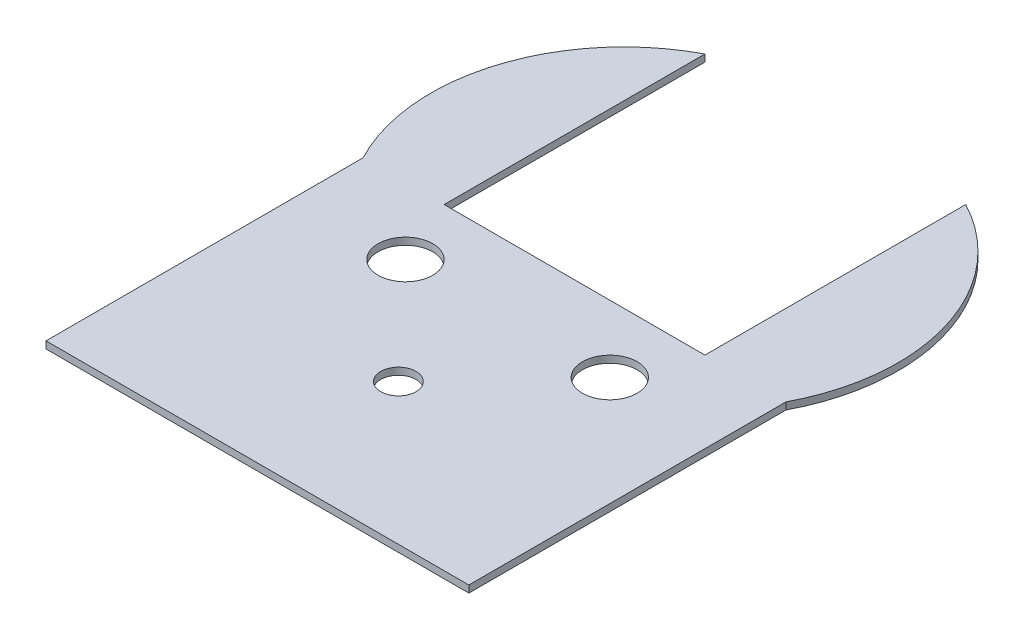
ISO-10303-21;
HEADER;
FILE_DESCRIPTION(('STEP AP214'),'2;1');
FILE_NAME('part.step','',(''),(''),'','','');
FILE_SCHEMA(('AUTOMOTIVE_DESIGN { 1 0 10303 214 1 1 1 1 }'));
ENDSEC;
DATA;
#1=APPLICATION_CONTEXT('core data for automotive mechanical design processes');
#2=APPLICATION_PROTOCOL_DEFINITION('international standard','automotive_design',2000,#1);
#3=PRODUCT_CONTEXT('',#1,'mechanical');
#4=PRODUCT('Part','Part','',(#3));
#5=PRODUCT_RELATED_PRODUCT_CATEGORY('part','',(#4));
#6=PRODUCT_DEFINITION_FORMATION('','',#4);
#7=PRODUCT_DEFINITION_CONTEXT('part definition',#1,'design');
#8=PRODUCT_DEFINITION('design','',#6,#7);
#9=PRODUCT_DEFINITION_SHAPE('','',#8);
#10=(LENGTH_UNIT() NAMED_UNIT(*) SI_UNIT(.MILLI.,.METRE.));
#11=(NAMED_UNIT(*) PLANE_ANGLE_UNIT() SI_UNIT($,.RADIAN.));
#12=(NAMED_UNIT(*) SI_UNIT($,.STERADIAN.) SOLID_ANGLE_UNIT());
#13=UNCERTAINTY_MEASURE_WITH_UNIT(LENGTH_MEASURE(1.E-05),#10,'distance_accuracy_value','');
#14=(GEOMETRIC_REPRESENTATION_CONTEXT(3) GLOBAL_UNCERTAINTY_ASSIGNED_CONTEXT((#13)) GLOBAL_UNIT_ASSIGNED_CONTEXT((#10,
#11,#12)) REPRESENTATION_CONTEXT('',''));
#15=CARTESIAN_POINT('',(0.,0.,0.));
#16=DIRECTION('',(0.,0.,1.));
#17=DIRECTION('',(1.,0.,0.));
#18=AXIS2_PLACEMENT_3D('',#15,#16,#17);
#19=CARTESIAN_POINT('',(-19.8017026169906,1.,0.));
#20=DIRECTION('',(-1.,0.,0.));
#21=DIRECTION('',(0.,0.,1.));
#22=AXIS2_PLACEMENT_3D('',#19,#20,#21);
#23=PLANE('',#22);
#24=DIRECTION('',(0.,0.,-1.));
#25=VECTOR('',#24,1.);
#26=CARTESIAN_POINT('',(-19.8017026169906,0.,0.));
#27=LINE('',#26,#25);
#28=CARTESIAN_POINT('',(-19.8017026169906,0.,0.));
#29=VERTEX_POINT('',#28);
#30=CARTESIAN_POINT('',(-19.8017026169906,0.,-37.));
#31=VERTEX_POINT('',#30);
#32=EDGE_CURVE('E132',#29,#31,#27,.T.);
#33=ORIENTED_EDGE('',*,*,#32,.T.);
#34=DIRECTION('',(0.,-1.,0.));
#35=VECTOR('',#34,1.);
#36=CARTESIAN_POINT('',(-19.8017026169906,1.,-37.));
#37=LINE('',#36,#35);
#38=CARTESIAN_POINT('',(-19.8017026169906,1.,-37.));
#39=VERTEX_POINT('',#38);
#40=EDGE_CURVE('E11',#39,#31,#37,.T.);
#41=ORIENTED_EDGE('',*,*,#40,.F.);
#42=DIRECTION('',(0.,0.,-1.));
#43=VECTOR('',#42,1.);
#44=CARTESIAN_POINT('',(-19.8017026169906,1.,0.));
#45=LINE('',#44,#43);
#46=CARTESIAN_POINT('',(-19.8017026169906,1.,0.));
#47=VERTEX_POINT('',#46);
#48=EDGE_CURVE('E146',#47,#39,#45,.T.);
#49=ORIENTED_EDGE('',*,*,#48,.F.);
#50=DIRECTION('',(0.,-1.,0.));
#51=VECTOR('',#50,1.);
#52=CARTESIAN_POINT('',(-19.8017026169906,1.,0.));
#53=LINE('',#52,#51);
#54=EDGE_CURVE('E128',#47,#29,#53,.T.);
#55=ORIENTED_EDGE('',*,*,#54,.T.);
#56=EDGE_LOOP('',(#33,#41,#49,#55));
#57=FACE_BOUND('',#56,.T.);
#58=ADVANCED_FACE('F35',(#57),#23,.F.);
#59=CARTESIAN_POINT('',(-7.0517026169905,1.,-12.75));
#60=DIRECTION('',(0.,-1.,0.));
#61=DIRECTION('',(0.,0.,-1.));
#62=AXIS2_PLACEMENT_3D('',#59,#60,#61);
#63=CYLINDRICAL_SURFACE('',#62,27.3975363855951);
#64=CARTESIAN_POINT('',(-7.0517026169905,0.,-12.75));
#65=DIRECTION('',(0.,1.,0.));
#66=DIRECTION('',(0.,0.,1.));
#67=AXIS2_PLACEMENT_3D('',#64,#65,#66);
#68=CIRCLE('',#67,27.3975363855951);
#69=CARTESIAN_POINT('',(-31.3017026169906,0.,0.));
#70=VERTEX_POINT('',#69);
#71=EDGE_CURVE('E135',#31,#70,#68,.T.);
#72=ORIENTED_EDGE('',*,*,#71,.T.);
#73=DIRECTION('',(0.,-1.,0.));
#74=VECTOR('',#73,1.);
#75=CARTESIAN_POINT('',(-31.3017026169906,1.,0.));
#76=LINE('',#75,#74);
#77=CARTESIAN_POINT('',(-31.3017026169906,1.,0.));
#78=VERTEX_POINT('',#77);
#79=EDGE_CURVE('E44',#78,#70,#76,.T.);
#80=ORIENTED_EDGE('',*,*,#79,.F.);
#81=CARTESIAN_POINT('',(-7.0517026169905,1.,-12.75));
#82=DIRECTION('',(0.,1.,0.));
#83=DIRECTION('',(0.,0.,1.));
#84=AXIS2_PLACEMENT_3D('',#81,#82,#83);
#85=CIRCLE('',#84,27.3975363855951);
#86=EDGE_CURVE('E95',#39,#78,#85,.T.);
#87=ORIENTED_EDGE('',*,*,#86,.F.);
#88=ORIENTED_EDGE('',*,*,#40,.T.);
#89=EDGE_LOOP('',(#72,#80,#87,#88));
#90=FACE_BOUND('',#89,.T.);
#91=ADVANCED_FACE('F219',(#90),#63,.T.);
#92=CARTESIAN_POINT('',(-31.3017026169906,1.,0.));
#93=DIRECTION('',(1.,0.,0.));
#94=DIRECTION('',(0.,0.,-1.));
#95=AXIS2_PLACEMENT_3D('',#92,#93,#94);
#96=PLANE('',#95);
#97=DIRECTION('',(0.,0.,1.));
#98=VECTOR('',#97,1.);
#99=CARTESIAN_POINT('',(-31.3017026169906,0.,0.));
#100=LINE('',#99,#98);
#101=CARTESIAN_POINT('',(-31.3017026169906,0.,45.));
#102=VERTEX_POINT('',#101);
#103=EDGE_CURVE('E137',#70,#102,#100,.T.);
#104=ORIENTED_EDGE('',*,*,#103,.T.);
#105=DIRECTION('',(0.,-1.,0.));
#106=VECTOR('',#105,1.);
#107=CARTESIAN_POINT('',(-31.3017026169906,1.,45.));
#108=LINE('',#107,#106);
#109=CARTESIAN_POINT('',(-31.3017026169906,1.,45.));
#110=VERTEX_POINT('',#109);
#111=EDGE_CURVE('E153',#110,#102,#108,.T.);
#112=ORIENTED_EDGE('',*,*,#111,.F.);
#113=DIRECTION('',(0.,0.,1.));
#114=VECTOR('',#113,1.);
#115=CARTESIAN_POINT('',(-31.3017026169906,1.,0.));
#116=LINE('',#115,#114);
#117=EDGE_CURVE('E162',#78,#110,#116,.T.);
#118=ORIENTED_EDGE('',*,*,#117,.F.);
#119=ORIENTED_EDGE('',*,*,#79,.T.);
#120=EDGE_LOOP('',(#104,#112,#118,#119));
#121=FACE_BOUND('',#120,.T.);
#122=ADVANCED_FACE('F160',(#121),#96,.F.);
#123=CARTESIAN_POINT('',(-31.3017026169906,1.,45.));
#124=DIRECTION('',(0.,0.,-1.));
#125=DIRECTION('',(-1.,0.,0.));
#126=AXIS2_PLACEMENT_3D('',#123,#124,#125);
#127=PLANE('',#126);
#128=DIRECTION('',(1.,0.,0.));
#129=VECTOR('',#128,1.);
#130=CARTESIAN_POINT('',(-31.3017026169906,0.,45.));
#131=LINE('',#130,#129);
#132=CARTESIAN_POINT('',(28.6982973830094,0.,45.));
#133=VERTEX_POINT('',#132);
#134=EDGE_CURVE('E139',#102,#133,#131,.T.);
#135=ORIENTED_EDGE('',*,*,#134,.T.);
#136=DIRECTION('',(0.,-1.,0.));
#137=VECTOR('',#136,1.);
#138=CARTESIAN_POINT('',(28.6982973830094,1.,45.));
#139=LINE('',#138,#137);
#140=CARTESIAN_POINT('',(28.6982973830094,1.,45.));
#141=VERTEX_POINT('',#140);
#142=EDGE_CURVE('E150',#141,#133,#139,.T.);
#143=ORIENTED_EDGE('',*,*,#142,.F.);
#144=DIRECTION('',(1.,0.,0.));
#145=VECTOR('',#144,1.);
#146=CARTESIAN_POINT('',(-31.3017026169906,1.,45.));
#147=LINE('',#146,#145);
#148=EDGE_CURVE('E174',#110,#141,#147,.T.);
#149=ORIENTED_EDGE('',*,*,#148,.F.);
#150=ORIENTED_EDGE('',*,*,#111,.T.);
#151=EDGE_LOOP('',(#135,#143,#149,#150));
#152=FACE_BOUND('',#151,.T.);
#153=ADVANCED_FACE('F170',(#152),#127,.F.);
#154=CARTESIAN_POINT('',(28.6982973830094,1.,45.));
#155=DIRECTION('',(-1.,0.,0.));
#156=DIRECTION('',(0.,0.,1.));
#157=AXIS2_PLACEMENT_3D('',#154,#155,#156);
#158=PLANE('',#157);
#159=DIRECTION('',(0.,0.,-1.));
#160=VECTOR('',#159,1.);
#161=CARTESIAN_POINT('',(28.6982973830094,0.,45.));
#162=LINE('',#161,#160);
#163=CARTESIAN_POINT('',(28.6982973830094,0.,0.));
#164=VERTEX_POINT('',#163);
#165=EDGE_CURVE('E141',#133,#164,#162,.T.);
#166=ORIENTED_EDGE('',*,*,#165,.T.);
#167=DIRECTION('',(0.,-1.,0.));
#168=VECTOR('',#167,1.);
#169=CARTESIAN_POINT('',(28.6982973830094,1.,0.));
#170=LINE('',#169,#168);
#171=CARTESIAN_POINT('',(28.6982973830094,1.,0.));
#172=VERTEX_POINT('',#171);
#173=EDGE_CURVE('E123',#172,#164,#170,.T.);
#174=ORIENTED_EDGE('',*,*,#173,.F.);
#175=DIRECTION('',(0.,0.,-1.));
#176=VECTOR('',#175,1.);
#177=CARTESIAN_POINT('',(28.6982973830094,1.,45.));
#178=LINE('',#177,#176);
#179=EDGE_CURVE('E114',#141,#172,#178,.T.);
#180=ORIENTED_EDGE('',*,*,#179,.F.);
#181=ORIENTED_EDGE('',*,*,#142,.T.);
#182=EDGE_LOOP('',(#166,#174,#180,#181));
#183=FACE_BOUND('',#182,.T.);
#184=ADVANCED_FACE('F173',(#183),#158,.F.);
#185=CARTESIAN_POINT('',(4.44829738300937,1.,-12.75));
#186=DIRECTION('',(0.,-1.,0.));
#187=DIRECTION('',(0.,0.,-1.));
#188=AXIS2_PLACEMENT_3D('',#185,#186,#187);
#189=CYLINDRICAL_SURFACE('',#188,27.397536385595);
#190=CARTESIAN_POINT('',(4.44829738300937,0.,-12.75));
#191=DIRECTION('',(0.,1.,0.));
#192=DIRECTION('',(0.,0.,-1.));
#193=AXIS2_PLACEMENT_3D('',#190,#191,#192);
#194=CIRCLE('',#193,27.397536385595);
#195=CARTESIAN_POINT('',(17.1982973830094,0.,-37.));
#196=VERTEX_POINT('',#195);
#197=EDGE_CURVE('E122',#164,#196,#194,.T.);
#198=ORIENTED_EDGE('',*,*,#197,.T.);
#199=DIRECTION('',(0.,-1.,0.));
#200=VECTOR('',#199,1.);
#201=CARTESIAN_POINT('',(17.1982973830094,1.,-37.));
#202=LINE('',#201,#200);
#203=CARTESIAN_POINT('',(17.1982973830094,1.,-37.));
#204=VERTEX_POINT('',#203);
#205=EDGE_CURVE('E119',#204,#196,#202,.T.);
#206=ORIENTED_EDGE('',*,*,#205,.F.);
#207=CARTESIAN_POINT('',(4.44829738300937,1.,-12.75));
#208=DIRECTION('',(0.,1.,0.));
#209=DIRECTION('',(0.,0.,-1.));
#210=AXIS2_PLACEMENT_3D('',#207,#208,#209);
#211=CIRCLE('',#210,27.397536385595);
#212=EDGE_CURVE('E108',#172,#204,#211,.T.);
#213=ORIENTED_EDGE('',*,*,#212,.F.);
#214=ORIENTED_EDGE('',*,*,#173,.T.);
#215=EDGE_LOOP('',(#198,#206,#213,#214));
#216=FACE_BOUND('',#215,.T.);
#217=ADVANCED_FACE('F120',(#216),#189,.T.);
#218=CARTESIAN_POINT('',(17.1982973830094,1.,0.));
#219=DIRECTION('',(1.,0.,0.));
#220=DIRECTION('',(0.,0.,-1.));
#221=AXIS2_PLACEMENT_3D('',#218,#219,#220);
#222=PLANE('',#221);
#223=DIRECTION('',(0.,0.,1.));
#224=VECTOR('',#223,1.);
#225=CARTESIAN_POINT('',(17.1982973830094,0.,0.));
#226=LINE('',#225,#224);
#227=CARTESIAN_POINT('',(17.1982973830094,0.,0.));
#228=VERTEX_POINT('',#227);
#229=EDGE_CURVE('E81',#196,#228,#226,.T.);
#230=ORIENTED_EDGE('',*,*,#229,.T.);
#231=DIRECTION('',(0.,-1.,0.));
#232=VECTOR('',#231,1.);
#233=CARTESIAN_POINT('',(17.1982973830094,1.,0.));
#234=LINE('',#233,#232);
#235=CARTESIAN_POINT('',(17.1982973830094,1.,0.));
#236=VERTEX_POINT('',#235);
#237=EDGE_CURVE('E124',#236,#228,#234,.T.);
#238=ORIENTED_EDGE('',*,*,#237,.F.);
#239=DIRECTION('',(0.,0.,1.));
#240=VECTOR('',#239,1.);
#241=CARTESIAN_POINT('',(17.1982973830094,1.,0.));
#242=LINE('',#241,#240);
#243=EDGE_CURVE('E112',#204,#236,#242,.T.);
#244=ORIENTED_EDGE('',*,*,#243,.F.);
#245=ORIENTED_EDGE('',*,*,#205,.T.);
#246=EDGE_LOOP('',(#230,#238,#244,#245));
#247=FACE_BOUND('',#246,.T.);
#248=ADVANCED_FACE('F126',(#247),#222,.F.);
#249=CARTESIAN_POINT('',(-19.8017026169906,1.,0.));
#250=DIRECTION('',(0.,0.,1.));
#251=DIRECTION('',(1.,0.,0.));
#252=AXIS2_PLACEMENT_3D('',#249,#250,#251);
#253=PLANE('',#252);
#254=DIRECTION('',(-1.,0.,0.));
#255=VECTOR('',#254,1.);
#256=CARTESIAN_POINT('',(-19.8017026169906,0.,0.));
#257=LINE('',#256,#255);
#258=EDGE_CURVE('E87',#228,#29,#257,.T.);
#259=ORIENTED_EDGE('',*,*,#258,.T.);
#260=ORIENTED_EDGE('',*,*,#54,.F.);
#261=DIRECTION('',(-1.,0.,0.));
#262=VECTOR('',#261,1.);
#263=CARTESIAN_POINT('',(-19.8017026169906,1.,0.));
#264=LINE('',#263,#262);
#265=EDGE_CURVE('E52',#236,#47,#264,.T.);
#266=ORIENTED_EDGE('',*,*,#265,.F.);
#267=ORIENTED_EDGE('',*,*,#237,.T.);
#268=EDGE_LOOP('',(#259,#260,#266,#267));
#269=FACE_BOUND('',#268,.T.);
#270=ADVANCED_FACE('F226',(#269),#253,.F.);
#271=CARTESIAN_POINT('',(-7.0517026169905,1.,-12.75));
#272=DIRECTION('',(0.,1.,0.));
#273=DIRECTION('',(0.,0.,1.));
#274=AXIS2_PLACEMENT_3D('',#271,#272,#273);
#275=PLANE('',#274);
#276=CARTESIAN_POINT('',(13.1982973830094,0.999999999999999,9.5));
#277=DIRECTION('',(0.,1.,0.));
#278=DIRECTION('',(0.,0.,1.));
#279=AXIS2_PLACEMENT_3D('',#276,#277,#278);
#280=CIRCLE('',#279,3.88143107176716);
#281=CARTESIAN_POINT('',(13.1982973830094,0.999999999999999,13.3814310717672));
#282=VERTEX_POINT('',#281);
#283=EDGE_CURVE('E183',#282,#282,#280,.T.);
#284=ORIENTED_EDGE('',*,*,#283,.F.);
#285=EDGE_LOOP('',(#284));
#286=FACE_BOUND('',#285,.T.);
#287=CARTESIAN_POINT('',(-15.8017026169906,0.999999999999999,9.49999999999999));
#288=DIRECTION('',(0.,1.,0.));
#289=DIRECTION('',(0.,0.,1.));
#290=AXIS2_PLACEMENT_3D('',#287,#288,#289);
#291=CIRCLE('',#290,3.88143107176716);
#292=CARTESIAN_POINT('',(-15.8017026169906,0.999999999999999,13.3814310717672));
#293=VERTEX_POINT('',#292);
#294=EDGE_CURVE('E186',#293,#293,#291,.T.);
#295=ORIENTED_EDGE('',*,*,#294,.F.);
#296=EDGE_LOOP('',(#295));
#297=FACE_BOUND('',#296,.T.);
#298=CARTESIAN_POINT('',(-1.30170261699063,1.,25.));
#299=DIRECTION('',(0.,1.,0.));
#300=DIRECTION('',(0.,0.,1.));
#301=AXIS2_PLACEMENT_3D('',#298,#299,#300);
#302=CIRCLE('',#301,2.5);
#303=CARTESIAN_POINT('',(-1.30170261699063,1.,27.5));
#304=VERTEX_POINT('',#303);
#305=EDGE_CURVE('E180',#304,#304,#302,.T.);
#306=ORIENTED_EDGE('',*,*,#305,.F.);
#307=EDGE_LOOP('',(#306));
#308=FACE_BOUND('',#307,.T.);
#309=ORIENTED_EDGE('',*,*,#48,.T.);
#310=ORIENTED_EDGE('',*,*,#86,.T.);
#311=ORIENTED_EDGE('',*,*,#117,.T.);
#312=ORIENTED_EDGE('',*,*,#148,.T.);
#313=ORIENTED_EDGE('',*,*,#179,.T.);
#314=ORIENTED_EDGE('',*,*,#212,.T.);
#315=ORIENTED_EDGE('',*,*,#243,.T.);
#316=ORIENTED_EDGE('',*,*,#265,.T.);
#317=EDGE_LOOP('',(#309,#310,#311,#312,#313,#314,#315,#316));
#318=FACE_BOUND('',#317,.T.);
#319=ADVANCED_FACE('F110',(#286,#297,#308,#318),#275,.T.);
#320=CARTESIAN_POINT('',(-7.0517026169905,0.,-12.75));
#321=DIRECTION('',(0.,1.,0.));
#322=DIRECTION('',(0.,0.,1.));
#323=AXIS2_PLACEMENT_3D('',#320,#321,#322);
#324=PLANE('',#323);
#325=CARTESIAN_POINT('',(13.1982973830094,0.,9.5));
#326=DIRECTION('',(0.,-1.,0.));
#327=DIRECTION('',(0.,0.,-1.));
#328=AXIS2_PLACEMENT_3D('',#325,#326,#327);
#329=CIRCLE('',#328,3.88143107176716);
#330=CARTESIAN_POINT('',(13.1982973830094,0.,5.61856892823284));
#331=VERTEX_POINT('',#330);
#332=EDGE_CURVE('E189',#331,#331,#329,.T.);
#333=ORIENTED_EDGE('',*,*,#332,.F.);
#334=EDGE_LOOP('',(#333));
#335=FACE_BOUND('',#334,.T.);
#336=CARTESIAN_POINT('',(-15.8017026169906,0.,9.49999999999999));
#337=DIRECTION('',(0.,-1.,0.));
#338=DIRECTION('',(0.,0.,1.));
#339=AXIS2_PLACEMENT_3D('',#336,#337,#338);
#340=CIRCLE('',#339,3.88143107176716);
#341=CARTESIAN_POINT('',(-15.8017026169906,0.,13.3814310717672));
#342=VERTEX_POINT('',#341);
#343=EDGE_CURVE('E190',#342,#342,#340,.T.);
#344=ORIENTED_EDGE('',*,*,#343,.F.);
#345=EDGE_LOOP('',(#344));
#346=FACE_BOUND('',#345,.T.);
#347=CARTESIAN_POINT('',(-1.30170261699063,0.,25.));
#348=DIRECTION('',(0.,1.,0.));
#349=DIRECTION('',(0.,0.,1.));
#350=AXIS2_PLACEMENT_3D('',#347,#348,#349);
#351=CIRCLE('',#350,2.5);
#352=CARTESIAN_POINT('',(-1.30170261699063,0.,27.5));
#353=VERTEX_POINT('',#352);
#354=EDGE_CURVE('E38',#353,#353,#351,.T.);
#355=ORIENTED_EDGE('',*,*,#354,.T.);
#356=EDGE_LOOP('',(#355));
#357=FACE_BOUND('',#356,.T.);
#358=ORIENTED_EDGE('',*,*,#32,.F.);
#359=ORIENTED_EDGE('',*,*,#258,.F.);
#360=ORIENTED_EDGE('',*,*,#229,.F.);
#361=ORIENTED_EDGE('',*,*,#197,.F.);
#362=ORIENTED_EDGE('',*,*,#165,.F.);
#363=ORIENTED_EDGE('',*,*,#134,.F.);
#364=ORIENTED_EDGE('',*,*,#103,.F.);
#365=ORIENTED_EDGE('',*,*,#71,.F.);
#366=EDGE_LOOP('',(#358,#359,#360,#361,#362,#363,#364,#365));
#367=FACE_BOUND('',#366,.T.);
#368=ADVANCED_FACE('F166',(#335,#346,#357,#367),#324,.F.);
#369=CARTESIAN_POINT('',(-1.30170261699063,-19.,25.));
#370=DIRECTION('',(0.,1.,0.));
#371=DIRECTION('',(0.,0.,1.));
#372=AXIS2_PLACEMENT_3D('',#369,#370,#371);
#373=CYLINDRICAL_SURFACE('',#372,2.5);
#374=ORIENTED_EDGE('',*,*,#305,.T.);
#375=EDGE_LOOP('',(#374));
#376=FACE_BOUND('',#375,.T.);
#377=ORIENTED_EDGE('',*,*,#354,.F.);
#378=EDGE_LOOP('',(#377));
#379=FACE_BOUND('',#378,.T.);
#380=ADVANCED_FACE('F200',(#376,#379),#373,.F.);
#381=CARTESIAN_POINT('',(-15.8017026169906,10.,9.49999999999999));
#382=DIRECTION('',(0.,-1.,0.));
#383=DIRECTION('',(0.,0.,-1.));
#384=AXIS2_PLACEMENT_3D('',#381,#382,#383);
#385=CYLINDRICAL_SURFACE('',#384,3.88143107176716);
#386=ORIENTED_EDGE('',*,*,#294,.T.);
#387=EDGE_LOOP('',(#386));
#388=FACE_BOUND('',#387,.T.);
#389=ORIENTED_EDGE('',*,*,#343,.T.);
#390=EDGE_LOOP('',(#389));
#391=FACE_BOUND('',#390,.T.);
#392=ADVANCED_FACE('F208',(#388,#391),#385,.F.);
#393=CARTESIAN_POINT('',(13.1982973830094,10.,9.5));
#394=DIRECTION('',(0.,-1.,0.));
#395=DIRECTION('',(0.,0.,-1.));
#396=AXIS2_PLACEMENT_3D('',#393,#394,#395);
#397=CYLINDRICAL_SURFACE('',#396,3.88143107176716);
#398=ORIENTED_EDGE('',*,*,#283,.T.);
#399=EDGE_LOOP('',(#398));
#400=FACE_BOUND('',#399,.T.);
#401=ORIENTED_EDGE('',*,*,#332,.T.);
#402=EDGE_LOOP('',(#401));
#403=FACE_BOUND('',#402,.T.);
#404=ADVANCED_FACE('F196',(#400,#403),#397,.F.);
#405=CLOSED_SHELL('',(#58,#91,#122,#153,#184,#217,#248,#270,#319,#368,#380,#392,#404));
#406=MANIFOLD_SOLID_BREP('B2',#405);
#407=ADVANCED_BREP_SHAPE_REPRESENTATION('',(#18,#406),#14);
#408=SHAPE_DEFINITION_REPRESENTATION(#9,#407);
ENDSEC;
END-ISO-10303-21;
